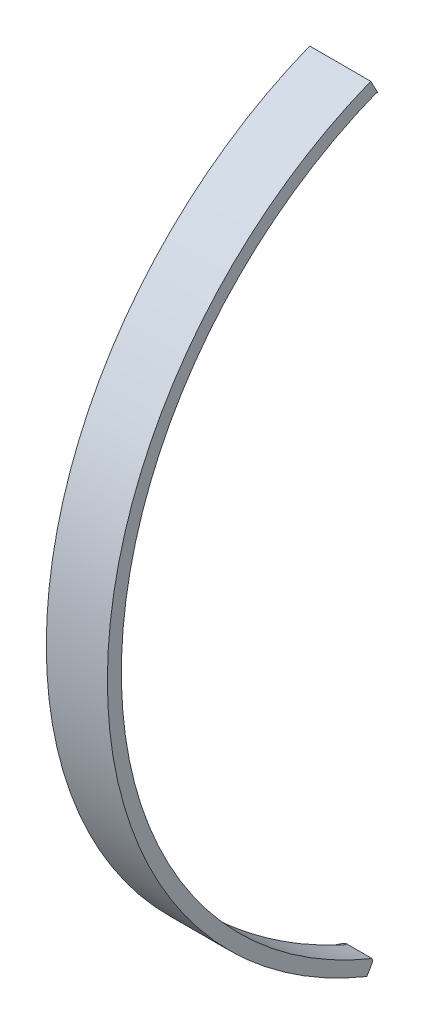
ISO-10303-21;
HEADER;
FILE_DESCRIPTION(('STEP AP214'),'2;1');
FILE_NAME('part.step','',(''),(''),'','','');
FILE_SCHEMA(('AUTOMOTIVE_DESIGN { 1 0 10303 214 1 1 1 1 }'));
ENDSEC;
DATA;
#1=APPLICATION_CONTEXT('core data for automotive mechanical design processes');
#2=APPLICATION_PROTOCOL_DEFINITION('international standard','automotive_design',2000,#1);
#3=PRODUCT_CONTEXT('',#1,'mechanical');
#4=PRODUCT('Part','Part','',(#3));
#5=PRODUCT_RELATED_PRODUCT_CATEGORY('part','',(#4));
#6=PRODUCT_DEFINITION_FORMATION('','',#4);
#7=PRODUCT_DEFINITION_CONTEXT('part definition',#1,'design');
#8=PRODUCT_DEFINITION('design','',#6,#7);
#9=PRODUCT_DEFINITION_SHAPE('','',#8);
#10=(LENGTH_UNIT() NAMED_UNIT(*) SI_UNIT(.MILLI.,.METRE.));
#11=(NAMED_UNIT(*) PLANE_ANGLE_UNIT() SI_UNIT($,.RADIAN.));
#12=(NAMED_UNIT(*) SI_UNIT($,.STERADIAN.) SOLID_ANGLE_UNIT());
#13=UNCERTAINTY_MEASURE_WITH_UNIT(LENGTH_MEASURE(1.E-05),#10,'distance_accuracy_value','');
#14=(GEOMETRIC_REPRESENTATION_CONTEXT(3) GLOBAL_UNCERTAINTY_ASSIGNED_CONTEXT((#13)) GLOBAL_UNIT_ASSIGNED_CONTEXT((#10,
#11,#12)) REPRESENTATION_CONTEXT('',''));
#15=CARTESIAN_POINT('',(0.,0.,0.));
#16=DIRECTION('',(0.,0.,1.));
#17=DIRECTION('',(1.,0.,0.));
#18=AXIS2_PLACEMENT_3D('',#15,#16,#17);
#19=CARTESIAN_POINT('',(-33.9,20.25,10.));
#20=DIRECTION('',(1.,0.,0.));
#21=DIRECTION('',(0.,0.,-1.));
#22=AXIS2_PLACEMENT_3D('',#19,#20,#21);
#23=CYLINDRICAL_SURFACE('',#22,23.8730192372937);
#24=CARTESIAN_POINT('',(-33.182142185749,-1.85759271429399,19.0097387244631));
#25=CARTESIAN_POINT('',(-33.1225665363095,-1.8340313483401,19.0675506331459));
#26=CARTESIAN_POINT('',(-33.0629498017503,-1.81025964298023,19.1252323032314));
#27=CARTESIAN_POINT('',(-32.9436341623926,-1.7622955534485,19.2403351662078));
#28=CARTESIAN_POINT('',(-32.8839352575941,-1.73810316927665,19.2977563590986));
#29=CARTESIAN_POINT('',(-32.8241952676759,-1.7137004456988,19.3550473133921));
#30=B_SPLINE_CURVE_WITH_KNOTS('',3,(#24,#25,#26,#27,#28,#29),.UNSPECIFIED.,.F.,.F.,(4,2,4),(0.,
0.258877995804225,0.517755991608455),.UNSPECIFIED.);
#31=CARTESIAN_POINT('',(-33.1821421857366,-1.85759271428874,19.0097387244721));
#32=VERTEX_POINT('',#31);
#33=CARTESIAN_POINT('',(-32.8241952676758,-1.71370044569875,19.3550473133921));
#34=VERTEX_POINT('',#33);
#35=EDGE_CURVE('E117',#32,#34,#30,.T.);
#36=ORIENTED_EDGE('',*,*,#35,.F.);
#37=DIRECTION('',(1.,0.,0.));
#38=VECTOR('',#37,1.);
#39=CARTESIAN_POINT('',(-33.9,-1.85759271429399,19.0097387244631));
#40=LINE('',#39,#38);
#41=CARTESIAN_POINT('',(-30.4,-1.85759271429399,19.0097387244631));
#42=VERTEX_POINT('',#41);
#43=EDGE_CURVE('E259',#32,#42,#40,.T.);
#44=ORIENTED_EDGE('',*,*,#43,.T.);
#45=CARTESIAN_POINT('',(-30.4,20.25,10.));
#46=DIRECTION('',(-1.,0.,0.));
#47=DIRECTION('',(0.,0.,1.));
#48=AXIS2_PLACEMENT_3D('',#45,#46,#47);
#49=CIRCLE('',#48,23.8730192372937);
#50=CARTESIAN_POINT('',(-30.4,42.4480016143393,18.7846327091112));
#51=VERTEX_POINT('',#50);
#52=EDGE_CURVE('E132',#42,#51,#49,.T.);
#53=ORIENTED_EDGE('',*,*,#52,.T.);
#54=DIRECTION('',(1.,0.,0.));
#55=VECTOR('',#54,1.);
#56=CARTESIAN_POINT('',(-33.9,42.4480016143393,18.7846327091112));
#57=LINE('',#56,#55);
#58=CARTESIAN_POINT('',(-33.9,42.4480016143393,18.7846327091112));
#59=VERTEX_POINT('',#58);
#60=EDGE_CURVE('E283',#59,#51,#57,.T.);
#61=ORIENTED_EDGE('',*,*,#60,.F.);
#62=CARTESIAN_POINT('',(-33.9,20.25,10.));
#63=DIRECTION('',(-1.,0.,0.));
#64=DIRECTION('',(0.,0.,1.));
#65=AXIS2_PLACEMENT_3D('',#62,#63,#64);
#66=CIRCLE('',#65,23.8730192372937);
#67=CARTESIAN_POINT('',(-33.9,2.27686480478922,25.7126528237236));
#68=VERTEX_POINT('',#67);
#69=EDGE_CURVE('E329',#68,#59,#66,.T.);
#70=ORIENTED_EDGE('',*,*,#69,.F.);
#71=CARTESIAN_POINT('',(-32.8241952676759,-1.7137004456988,19.3550473133921));
#72=CARTESIAN_POINT('',(-32.8482325235076,-1.63080687142153,19.5496663536201));
#73=CARTESIAN_POINT('',(-32.8726932525862,-1.54534385320424,19.7431386325032));
#74=CARTESIAN_POINT('',(-32.922412498383,-1.36966227853327,20.1269754393112));
#75=CARTESIAN_POINT('',(-32.9476679124561,-1.27946147274184,20.317348493742));
#76=CARTESIAN_POINT('',(-32.9990235283126,-1.09436437405675,20.6950109075044));
#77=CARTESIAN_POINT('',(-33.0251211624427,-0.999481958086965,20.882307417338));
#78=CARTESIAN_POINT('',(-33.0781980856319,-0.805072025152287,21.2538372897638));
#79=CARTESIAN_POINT('',(-33.1051754037122,-0.705554703783859,21.4380762691174));
#80=CARTESIAN_POINT('',(-33.1600294373046,-0.501913722063597,21.8035086082159));
#81=CARTESIAN_POINT('',(-33.1879048313361,-0.397796752980579,21.9847058952136));
#82=CARTESIAN_POINT('',(-33.244594023606,-0.184986562709229,22.3440652425988));
#83=CARTESIAN_POINT('',(-33.2734071350169,-0.0762966745829273,22.5222293851314));
#84=CARTESIAN_POINT('',(-33.332077245522,0.145638895481034,22.8755284208833));
#85=CARTESIAN_POINT('',(-33.3619342689464,0.258884683611083,23.0506632433567));
#86=CARTESIAN_POINT('',(-33.4227960899939,0.489913533511403,23.3978933685883));
#87=CARTESIAN_POINT('',(-33.4538016825473,0.607699740105736,23.5699864396878));
#88=CARTESIAN_POINT('',(-33.5170792381005,0.847798652330997,23.9111176923892));
#89=CARTESIAN_POINT('',(-33.549352916376,0.9701174753288,24.0801512504623));
#90=CARTESIAN_POINT('',(-33.6152983786745,1.21927694429589,24.4151411726627));
#91=CARTESIAN_POINT('',(-33.6489729646166,1.34612657277389,24.5810903045652));
#92=CARTESIAN_POINT('',(-33.7178669542654,1.60434939344927,24.9098817915395));
#93=CARTESIAN_POINT('',(-33.7530904484956,1.73573433876496,25.0727140600441));
#94=CARTESIAN_POINT('',(-33.825250903236,2.00303264140061,25.3952352892476));
#95=CARTESIAN_POINT('',(-33.8621935058577,2.13896042669196,25.554911029677));
#96=CARTESIAN_POINT('',(-33.9,2.2768648047892,25.7126528237236));
#97=B_SPLINE_CURVE_WITH_KNOTS('',3,(#71,#72,#73,#74,#75,#76,#77,#78,#79,#80,#81,#82,#83,#84,#85,
#86,#87,#88,#89,#90,#91,#92,#93,#94,#95,#96),.UNSPECIFIED.,.F.,.F.,(4,2,2,2,2,2,2,2,2,2,2,2,4),
(0.,0.638675930938489,1.2751094164787,1.90975814897991,2.54307129407708,3.17549166456088,
3.80745880860199,4.4394406915592,5.07186845843258,5.70518330143461,6.33983223149834,
6.97627177613453,7.61497207741191),.UNSPECIFIED.);
#98=EDGE_CURVE('E46',#34,#68,#97,.T.);
#99=ORIENTED_EDGE('',*,*,#98,.F.);
#100=EDGE_LOOP('',(#36,#44,#53,#61,#70,#99));
#101=FACE_BOUND('',#100,.T.);
#102=ADVANCED_FACE('F17',(#101),#23,.T.);
#103=CARTESIAN_POINT('',(-33.9,42.4480016143387,18.7846327091127));
#104=DIRECTION('',(0.,-0.464199920782459,0.885730451969198));
#105=DIRECTION('',(0.,-0.885730451969198,-0.464199920782459));
#106=AXIS2_PLACEMENT_3D('',#103,#104,#105);
#107=PLANE('',#106);
#108=CARTESIAN_POINT('',(-33.9,41.9383395792734,18.517525401492));
#109=CARTESIAN_POINT('',(-33.774944800215,41.8972438244927,18.4959876457659));
#110=CARTESIAN_POINT('',(-33.6500793311939,41.8557060092155,18.4742182118278));
#111=CARTESIAN_POINT('',(-33.4007278546792,41.7717462576684,18.4302159875276));
#112=CARTESIAN_POINT('',(-33.2762418471857,41.7293243213984,18.4079831971655));
#113=CARTESIAN_POINT('',(-33.151945570456,41.686460324632,18.3855187285914));
#114=B_SPLINE_CURVE_WITH_KNOTS('',3,(#108,#109,#110,#111,#112,#113),.UNSPECIFIED.,.F.,.F.,(4,2,
4),(0.,0.400145165349681,0.800290330699361),.UNSPECIFIED.);
#115=CARTESIAN_POINT('',(-33.9,41.9383395792748,18.5175254015118));
#116=VERTEX_POINT('',#115);
#117=CARTESIAN_POINT('',(-33.151945570456,41.6864603246321,18.3855187285914));
#118=VERTEX_POINT('',#117);
#119=EDGE_CURVE('E223',#116,#118,#114,.T.);
#120=ORIENTED_EDGE('',*,*,#119,.F.);
#121=DIRECTION('',(0.,-0.885730451969198,-0.464199920782459));
#122=VECTOR('',#121,1.);
#123=CARTESIAN_POINT('',(-33.9,42.4480016143387,18.7846327091127));
#124=LINE('',#123,#122);
#125=EDGE_CURVE('E279',#59,#116,#124,.T.);
#126=ORIENTED_EDGE('',*,*,#125,.F.);
#127=ORIENTED_EDGE('',*,*,#60,.T.);
#128=DIRECTION('',(0.,-0.885730451969198,-0.464199920782459));
#129=VECTOR('',#128,1.);
#130=CARTESIAN_POINT('',(-30.4,42.4480016143387,18.7846327091127));
#131=LINE('',#130,#129);
#132=CARTESIAN_POINT('',(-30.4,41.6864603246321,18.3855187285914));
#133=VERTEX_POINT('',#132);
#134=EDGE_CURVE('E338',#51,#133,#131,.T.);
#135=ORIENTED_EDGE('',*,*,#134,.T.);
#136=DIRECTION('',(1.,0.,0.));
#137=VECTOR('',#136,1.);
#138=CARTESIAN_POINT('',(-33.9,41.6864603246321,18.3855187285914));
#139=LINE('',#138,#137);
#140=EDGE_CURVE('E321',#118,#133,#139,.T.);
#141=ORIENTED_EDGE('',*,*,#140,.F.);
#142=EDGE_LOOP('',(#120,#126,#127,#135,#141));
#143=FACE_BOUND('',#142,.T.);
#144=ADVANCED_FACE('F239',(#143),#107,.F.);
#145=CARTESIAN_POINT('',(-33.9,41.6864603246321,18.3855187285914));
#146=DIRECTION('',(0.,0.986061709742894,-0.166380000537688));
#147=DIRECTION('',(0.,0.166380000537688,0.986061709742894));
#148=AXIS2_PLACEMENT_3D('',#145,#146,#147);
#149=PLANE('',#148);
#150=CARTESIAN_POINT('',(-33.151945570456,41.6864603246321,18.3855187285914));
#151=CARTESIAN_POINT('',(-33.162021348843,41.6923510551329,18.4204305194947));
#152=CARTESIAN_POINT('',(-33.1720971272299,41.6982417856337,18.4553423103981));
#153=CARTESIAN_POINT('',(-33.1821729056168,41.7041325161345,18.4902541013014));
#154=B_SPLINE_CURVE_WITH_KNOTS('',3,(#150,#151,#152,#153),.UNSPECIFIED.,.F.,.F.,(4,4),(0.,
0.110433221632523),.UNSPECIFIED.);
#155=CARTESIAN_POINT('',(-33.1821729056168,41.7041325161345,18.4902541013014));
#156=VERTEX_POINT('',#155);
#157=EDGE_CURVE('E234',#118,#156,#154,.T.);
#158=ORIENTED_EDGE('',*,*,#157,.F.);
#159=ORIENTED_EDGE('',*,*,#140,.T.);
#160=DIRECTION('',(0.,0.166380000537688,0.986061709742894));
#161=VECTOR('',#160,1.);
#162=CARTESIAN_POINT('',(-30.4,41.6864603246321,18.3855187285914));
#163=LINE('',#162,#161);
#164=CARTESIAN_POINT('',(-30.4,41.7041325161345,18.4902541013014));
#165=VERTEX_POINT('',#164);
#166=EDGE_CURVE('E318',#133,#165,#163,.T.);
#167=ORIENTED_EDGE('',*,*,#166,.T.);
#168=DIRECTION('',(1.,0.,0.));
#169=VECTOR('',#168,1.);
#170=CARTESIAN_POINT('',(-33.9,41.7041325161345,18.4902541013014));
#171=LINE('',#170,#169);
#172=EDGE_CURVE('E313',#156,#165,#171,.T.);
#173=ORIENTED_EDGE('',*,*,#172,.F.);
#174=EDGE_LOOP('',(#158,#159,#167,#173));
#175=FACE_BOUND('',#174,.T.);
#176=ADVANCED_FACE('F242',(#175),#149,.F.);
#177=CARTESIAN_POINT('',(-33.9,20.25,10.));
#178=DIRECTION('',(1.,0.,0.));
#179=DIRECTION('',(0.,0.,-1.));
#180=AXIS2_PLACEMENT_3D('',#177,#178,#179);
#181=CYLINDRICAL_SURFACE('',#180,23.0730192372937);
#182=CARTESIAN_POINT('',(-31.7922370176084,-1.07793633890972,18.8024626240581));
#183=CARTESIAN_POINT('',(-31.8070935159219,-1.08443498978618,18.7867167996909));
#184=CARTESIAN_POINT('',(-31.8219412222999,-1.09091905994948,18.7709567247907));
#185=CARTESIAN_POINT('',(-31.851619051185,-1.10385803884976,18.7394080739237));
#186=CARTESIAN_POINT('',(-31.8664491736921,-1.11031294758674,18.7236194979571));
#187=CARTESIAN_POINT('',(-31.8812705042638,-1.11675327561056,18.7078166714573));
#188=B_SPLINE_CURVE_WITH_KNOTS('',3,(#182,#183,#184,#185,#186,#187),.UNSPECIFIED.,.F.,.F.,(4,2,
4),(0.,0.067807798982838,0.135615597965672),.UNSPECIFIED.);
#189=CARTESIAN_POINT('',(-31.7922370175579,-1.077936338877,18.8024626240297));
#190=VERTEX_POINT('',#189);
#191=CARTESIAN_POINT('',(-31.8812705042638,-1.11675327561056,18.7078166714573));
#192=VERTEX_POINT('',#191);
#193=EDGE_CURVE('E114',#190,#192,#188,.T.);
#194=ORIENTED_EDGE('',*,*,#193,.F.);
#195=CARTESIAN_POINT('',(-33.9,12.8363926180405,31.8495455859082));
#196=CARTESIAN_POINT('',(-33.864928216694,12.5284323234193,31.7450592677378));
#197=CARTESIAN_POINT('',(-33.8287411920487,12.222783634175,31.6340863641721));
#198=CARTESIAN_POINT('',(-33.7543675851645,11.6167207491469,31.3994441990567));
#199=CARTESIAN_POINT('',(-33.716181423948,11.3163054688165,31.2757776055964));
#200=CARTESIAN_POINT('',(-33.6575656898599,10.869978453453,31.0809338696909));
#201=CARTESIAN_POINT('',(-33.6378049683533,10.7219230885651,31.0144307587432));
#202=CARTESIAN_POINT('',(-33.5978477316943,10.4272968766735,30.8783392492714));
#203=CARTESIAN_POINT('',(-33.5776512167745,10.2807260288771,30.808750852395));
#204=CARTESIAN_POINT('',(-33.5163097779612,9.84336122489024,30.5954197312984));
#205=CARTESIAN_POINT('',(-33.474409560197,9.55488897001684,30.4470997077477));
#206=CARTESIAN_POINT('',(-33.3886824714112,8.98448260247668,30.1384601138862));
#207=CARTESIAN_POINT('',(-33.344854297136,8.70255311550599,29.9781323735594));
#208=CARTESIAN_POINT('',(-33.255914824139,8.14584124511983,29.6458302952307));
#209=CARTESIAN_POINT('',(-33.2108034968033,7.87105902134851,29.4738556973884));
#210=CARTESIAN_POINT('',(-33.1202292859298,7.32901773628106,29.1185107865197));
#211=CARTESIAN_POINT('',(-33.0747663977575,7.06175877437741,28.9351403230411));
#212=CARTESIAN_POINT('',(-32.9846203071851,6.53512110272461,28.5572454979617));
#213=CARTESIAN_POINT('',(-32.9399371008171,6.2757423528681,28.3627211931444));
#214=CARTESIAN_POINT('',(-32.8376471667455,5.67866211819569,27.8949388005632));
#215=CARTESIAN_POINT('',(-32.780793813853,5.34421397769663,27.6173430821481));
#216=CARTESIAN_POINT('',(-32.6718480989232,4.69110606187275,27.0432994653673));
#217=CARTESIAN_POINT('',(-32.6197557345576,4.37244627882651,26.7468515762215));
#218=CARTESIAN_POINT('',(-32.5205763787576,3.75198998803313,26.1359667315062));
#219=CARTESIAN_POINT('',(-32.4734897341661,3.45019464949761,25.8215285317199));
#220=CARTESIAN_POINT('',(-32.3839659663844,2.86505056663772,25.1762037681624));
#221=CARTESIAN_POINT('',(-32.3415217483317,2.58167395037315,24.8453434595516));
#222=CARTESIAN_POINT('',(-32.2603982110107,2.03391539519608,24.1678593777943));
#223=CARTESIAN_POINT('',(-32.2217186637,1.7695323060179,23.8212365613196));
#224=CARTESIAN_POINT('',(-32.1474639750808,1.26075786263175,23.1134569045218));
#225=CARTESIAN_POINT('',(-32.1118877261564,1.01635937756989,22.7523053175498));
#226=CARTESIAN_POINT('',(-32.0599404907262,0.661830606769009,22.1950106961693));
#227=CARTESIAN_POINT('',(-32.0426219772408,0.544059488319621,22.0037734689145));
#228=CARTESIAN_POINT('',(-32.0086073447502,0.314150316916037,21.6179397851926));
#229=CARTESIAN_POINT('',(-31.9919110836602,0.202010975947019,21.4233441106243));
#230=CARTESIAN_POINT('',(-31.9590972299086,-0.0165445064632739,21.0309484214267));
#231=CARTESIAN_POINT('',(-31.9429795711788,-0.122961302035939,20.8331487764138));
#232=CARTESIAN_POINT('',(-31.9113344148302,-0.329889801814305,20.4346873479759));
#233=CARTESIAN_POINT('',(-31.8958063485031,-0.430407250269796,20.2340285933646));
#234=CARTESIAN_POINT('',(-31.865302064466,-0.625571558994802,19.8298068351366));
#235=CARTESIAN_POINT('',(-31.8503259094077,-0.720217753601832,19.6262435054156));
#236=CARTESIAN_POINT('',(-31.820895818405,-0.90356447215441,19.2163634772633));
#237=CARTESIAN_POINT('',(-31.8064420022196,-0.992263636534426,19.0100461620757));
#238=CARTESIAN_POINT('',(-31.7922370176084,-1.07793633890972,18.8024626240581));
#239=B_SPLINE_CURVE_WITH_KNOTS('',3,(#195,#196,#197,#198,#199,#200,#201,#202,#203,#204,#205,
#206,#207,#208,#209,#210,#211,#212,#213,#214,#215,#216,#217,#218,#219,#220,#221,#222,#223,#224,
#225,#226,#227,#228,#229,#230,#231,#232,#233,#234,#235,#236,#237,#238),.UNSPECIFIED.,.F.,.F.,(4,
2,2,2,2,2,2,2,2,2,2,2,2,2,2,2,2,2,2,2,2,4),(0.,0.981223808385092,1.96224179383039,
2.45272172515589,2.9432013945651,3.92407495933614,4.9056220790544,5.88719110421151,
6.8687730911453,7.85035008135187,9.16464831857646,10.4789459130263,11.7933345149409,
13.1056854555461,14.4179568518409,15.7297579448956,16.4054553548837,17.0809975192037,
17.7564622989424,18.4312580709972,19.1061302097637,19.7811561103552),.UNSPECIFIED.);
#240=CARTESIAN_POINT('',(-33.9,12.8363926180095,31.8495455858988));
#241=VERTEX_POINT('',#240);
#242=EDGE_CURVE('E99',#241,#190,#239,.T.);
#243=ORIENTED_EDGE('',*,*,#242,.F.);
#244=CARTESIAN_POINT('',(-33.9,20.25,10.));
#245=DIRECTION('',(1.,0.,0.));
#246=DIRECTION('',(0.,0.,1.));
#247=AXIS2_PLACEMENT_3D('',#244,#245,#246);
#248=CIRCLE('',#247,23.0730192372937);
#249=CARTESIAN_POINT('',(-33.9,30.8113071885345,30.5139710244978));
#250=VERTEX_POINT('',#249);
#251=EDGE_CURVE('E271',#250,#241,#248,.T.);
#252=ORIENTED_EDGE('',*,*,#251,.F.);
#253=CARTESIAN_POINT('',(-32.6308216737922,41.548176793347,18.8742257129205));
#254=CARTESIAN_POINT('',(-32.6433927442418,41.3808301908767,19.2759009727296));
#255=CARTESIAN_POINT('',(-32.6570202577415,41.2021011519144,19.6728050345782));
#256=CARTESIAN_POINT('',(-32.687295904126,40.822572831126,20.4557398097733));
#257=CARTESIAN_POINT('',(-32.7039436799637,40.6217761591787,20.8417718021605));
#258=CARTESIAN_POINT('',(-32.7411688869953,40.1987814101402,21.6017017300487));
#259=CARTESIAN_POINT('',(-32.7617460567703,39.9765847572564,21.9756004708285));
#260=CARTESIAN_POINT('',(-32.8062070388864,39.5182193494979,22.6995342937859));
#261=CARTESIAN_POINT('',(-32.8299789964265,39.2826346445929,23.0499462889606));
#262=CARTESIAN_POINT('',(-32.8812125379729,38.7927375154648,23.7371452652056));
#263=CARTESIAN_POINT('',(-32.9086741073967,38.5384251652605,24.0739323001187));
#264=CARTESIAN_POINT('',(-32.967270340274,38.0118867535585,24.7328703245115));
#265=CARTESIAN_POINT('',(-32.9984050866922,37.7396602875027,25.0550209831771));
#266=CARTESIAN_POINT('',(-33.0675668851951,37.1504438901436,25.7147584930318));
#267=CARTESIAN_POINT('',(-33.1059709002589,36.8316877200982,26.0507307686006));
#268=CARTESIAN_POINT('',(-33.1871188238533,36.1747892012193,26.7026785969265));
#269=CARTESIAN_POINT('',(-33.2298632740739,35.8366444349708,27.0186516457556));
#270=CARTESIAN_POINT('',(-33.3195369441355,35.1422591043525,27.6294840320543));
#271=CARTESIAN_POINT('',(-33.366466691519,34.7860162612241,27.9243406994067));
#272=CARTESIAN_POINT('',(-33.4654522931773,34.0448894720928,28.5011568280406));
#273=CARTESIAN_POINT('',(-33.5176251727015,33.6594509814723,28.7823857445943));
#274=CARTESIAN_POINT('',(-33.5978128230588,33.069035770376,29.1857599718008));
#275=CARTESIAN_POINT('',(-33.6248647355813,32.8701782228701,29.3171455556914));
#276=CARTESIAN_POINT('',(-33.6794046445558,32.4685237590447,29.5736727791256));
#277=CARTESIAN_POINT('',(-33.7068926410631,32.2657268422263,29.6988144178785));
#278=CARTESIAN_POINT('',(-33.7620625394061,31.8564047268479,29.9427265086761));
#279=CARTESIAN_POINT('',(-33.7897444135396,31.6498800545335,30.0614978507552));
#280=CARTESIAN_POINT('',(-33.8450148880289,31.2332427517723,30.2925933958093));
#281=CARTESIAN_POINT('',(-33.8726034885237,31.0231301266684,30.4049176083836));
#282=CARTESIAN_POINT('',(-33.9,30.8113071885342,30.5139710244979));
#283=B_SPLINE_CURVE_WITH_KNOTS('',3,(#253,#254,#255,#256,#257,#258,#259,#260,#261,#262,#263,
#264,#265,#266,#267,#268,#269,#270,#271,#272,#273,#274,#275,#276,#277,#278,#279,#280,#281,#282),
.UNSPECIFIED.,.F.,.F.,(4,2,2,2,2,2,2,2,2,2,2,2,2,2,4),(0.,1.30579910046365,2.61144393347208,
3.91700193342772,5.18508897864352,6.4531710121632,7.72128169287522,9.11455057830523,
10.5079935590788,11.9016124275075,13.3405214392381,14.0600430932918,14.7795648384774,
15.4989857914485,16.2184056732078),.UNSPECIFIED.);
#284=CARTESIAN_POINT('',(-32.6308216737891,41.5481767933459,18.8742257129192));
#285=VERTEX_POINT('',#284);
#286=EDGE_CURVE('E38',#285,#250,#283,.T.);
#287=ORIENTED_EDGE('',*,*,#286,.F.);
#288=CARTESIAN_POINT('',(-33.1821729056168,41.7041325161345,18.4902541013014));
#289=CARTESIAN_POINT('',(-33.0905537361533,41.6785781182408,18.5548189385224));
#290=CARTESIAN_POINT('',(-32.9987982154367,41.6528046090618,18.6190989914341));
#291=CARTESIAN_POINT('',(-32.8150144714974,41.6008193681333,18.7470895286389));
#292=CARTESIAN_POINT('',(-32.7229862482747,41.5746076363837,18.8108000129321));
#293=CARTESIAN_POINT('',(-32.6308216737989,41.548176793349,18.8742257129159));
#294=B_SPLINE_CURVE_WITH_KNOTS('',3,(#288,#289,#290,#291,#292,#293),.UNSPECIFIED.,.F.,.F.,(4,2,
4),(0.,0.344873123100845,0.689746246201693),.UNSPECIFIED.);
#295=EDGE_CURVE('E135',#156,#285,#294,.T.);
#296=ORIENTED_EDGE('',*,*,#295,.F.);
#297=ORIENTED_EDGE('',*,*,#172,.T.);
#298=CARTESIAN_POINT('',(-30.4,20.25,10.));
#299=DIRECTION('',(1.,0.,0.));
#300=DIRECTION('',(0.,0.,1.));
#301=AXIS2_PLACEMENT_3D('',#298,#299,#300);
#302=CIRCLE('',#301,23.0730192372937);
#303=CARTESIAN_POINT('',(-30.4,-1.11675327561056,18.7078166714573));
#304=VERTEX_POINT('',#303);
#305=EDGE_CURVE('E334',#165,#304,#302,.T.);
#306=ORIENTED_EDGE('',*,*,#305,.T.);
#307=DIRECTION('',(1.,0.,0.));
#308=VECTOR('',#307,1.);
#309=CARTESIAN_POINT('',(-33.9,-1.11675327561056,18.7078166714573));
#310=LINE('',#309,#308);
#311=EDGE_CURVE('E125',#192,#304,#310,.T.);
#312=ORIENTED_EDGE('',*,*,#311,.F.);
#313=EDGE_LOOP('',(#194,#243,#252,#287,#296,#297,#306,#312));
#314=FACE_BOUND('',#313,.T.);
#315=ADVANCED_FACE('F123',(#314),#181,.F.);
#316=CARTESIAN_POINT('',(-33.9,-1.11675327561056,18.7078166714573));
#317=DIRECTION('',(0.,-0.226898717124298,0.973918360114105));
#318=DIRECTION('',(0.,-0.973918360114105,-0.226898717124298));
#319=AXIS2_PLACEMENT_3D('',#316,#317,#318);
#320=PLANE('',#319);
#321=CARTESIAN_POINT('',(-31.8812705042638,-1.11675327561056,18.7078166714573));
#322=CARTESIAN_POINT('',(-31.9301806101318,-1.14393731473797,18.7014834675083));
#323=CARTESIAN_POINT('',(-31.9791522566391,-1.17101523630979,18.6951749863063));
#324=CARTESIAN_POINT('',(-32.0772186309322,-1.22495884434227,18.6826074693964));
#325=CARTESIAN_POINT('',(-32.126313358718,-1.25182453080292,18.6763484336884));
#326=CARTESIAN_POINT('',(-32.1754696271431,-1.27858409970799,18.6701141207275));
#327=B_SPLINE_CURVE_WITH_KNOTS('',3,(#321,#322,#323,#324,#325,#326),.UNSPECIFIED.,.F.,.F.,(4,2,
4),(0.,0.16894110334737,0.337882206694745),.UNSPECIFIED.);
#328=CARTESIAN_POINT('',(-32.1754696271431,-1.27858409970799,18.6701141207275));
#329=VERTEX_POINT('',#328);
#330=EDGE_CURVE('E127',#192,#329,#327,.T.);
#331=ORIENTED_EDGE('',*,*,#330,.F.);
#332=ORIENTED_EDGE('',*,*,#311,.T.);
#333=DIRECTION('',(0.,-0.973918360114105,-0.226898717124298));
#334=VECTOR('',#333,1.);
#335=CARTESIAN_POINT('',(-30.4,-1.11675327561056,18.7078166714573));
#336=LINE('',#335,#334);
#337=CARTESIAN_POINT('',(-30.4,-1.27858409970799,18.6701141207275));
#338=VERTEX_POINT('',#337);
#339=EDGE_CURVE('E330',#304,#338,#336,.T.);
#340=ORIENTED_EDGE('',*,*,#339,.T.);
#341=DIRECTION('',(1.,0.,0.));
#342=VECTOR('',#341,1.);
#343=CARTESIAN_POINT('',(-33.9,-1.27858409970799,18.6701141207275));
#344=LINE('',#343,#342);
#345=EDGE_CURVE('E270',#329,#338,#344,.T.);
#346=ORIENTED_EDGE('',*,*,#345,.F.);
#347=EDGE_LOOP('',(#331,#332,#340,#346));
#348=FACE_BOUND('',#347,.T.);
#349=ADVANCED_FACE('F251',(#348),#320,.F.);
#350=CARTESIAN_POINT('',(-33.9,-1.27858409970799,18.6701141207275));
#351=DIRECTION('',(0.,0.505947614141217,0.862564207317235));
#352=DIRECTION('',(0.,-0.862564207317235,0.505947614141217));
#353=AXIS2_PLACEMENT_3D('',#350,#351,#352);
#354=PLANE('',#353);
#355=CARTESIAN_POINT('',(-32.1754696271431,-1.27858409970799,18.6701141207275));
#356=CARTESIAN_POINT('',(-32.230504423245,-1.31189695402527,18.6896541839704));
#357=CARTESIAN_POINT('',(-32.2856770672764,-1.34504070969902,18.7090950603302));
#358=CARTESIAN_POINT('',(-32.3963029990754,-1.41096416401955,18.7477632709358));
#359=CARTESIAN_POINT('',(-32.45175624842,-1.44374391064569,18.7669906333246));
#360=CARTESIAN_POINT('',(-32.5629589276403,-1.50891999060721,18.8052204623342));
#361=CARTESIAN_POINT('',(-32.6187083354352,-1.54131635196116,18.8242229453898));
#362=CARTESIAN_POINT('',(-32.730518893357,-1.60570730809408,18.8619922503892));
#363=CARTESIAN_POINT('',(-32.7865800461528,-1.63770189942572,18.880759070311));
#364=CARTESIAN_POINT('',(-32.8990273705287,-1.70127035813229,18.9180459293579));
#365=CARTESIAN_POINT('',(-32.9554135629879,-1.73284419803865,18.9365659523712));
#366=CARTESIAN_POINT('',(-33.0685240886729,-1.79555349020741,18.9733488567488));
#367=CARTESIAN_POINT('',(-33.1252484694636,-1.82668887862897,18.9916117006665));
#368=CARTESIAN_POINT('',(-33.1821421857366,-1.85759271428874,19.0097387244721));
#369=B_SPLINE_CURVE_WITH_KNOTS('',3,(#355,#356,#357,#358,#359,#360,#361,#362,#363,#364,#365,
#366,#367,#368),.UNSPECIFIED.,.F.,.F.,(4,2,2,2,2,2,4),(0.,0.201701423443757,0.403375937670601,
0.605035620948136,0.80669703334791,1.0083715472509,1.210075128559),.UNSPECIFIED.);
#370=EDGE_CURVE('E11',#329,#32,#369,.T.);
#371=ORIENTED_EDGE('',*,*,#370,.F.);
#372=ORIENTED_EDGE('',*,*,#345,.T.);
#373=DIRECTION('',(0.,-0.862564207317235,0.505947614141217));
#374=VECTOR('',#373,1.);
#375=CARTESIAN_POINT('',(-30.4,-1.27858409970799,18.6701141207275));
#376=LINE('',#375,#374);
#377=EDGE_CURVE('E267',#338,#42,#376,.T.);
#378=ORIENTED_EDGE('',*,*,#377,.T.);
#379=ORIENTED_EDGE('',*,*,#43,.F.);
#380=EDGE_LOOP('',(#371,#372,#378,#379));
#381=FACE_BOUND('',#380,.T.);
#382=ADVANCED_FACE('F264',(#381),#354,.F.);
#383=CARTESIAN_POINT('',(-33.9,20.25,10.));
#384=DIRECTION('',(-1.,0.,0.));
#385=DIRECTION('',(0.,0.,1.));
#386=AXIS2_PLACEMENT_3D('',#383,#384,#385);
#387=PLANE('',#386);
#388=ORIENTED_EDGE('',*,*,#125,.T.);
#389=CARTESIAN_POINT('',(-33.9,41.9225736648829,18.2925937255391));
#390=CARTESIAN_POINT('',(-33.9,41.9358131259489,18.481151856025));
#391=CARTESIAN_POINT('',(-33.9,41.9489959913007,18.6697139261954));
#392=CARTESIAN_POINT('',(-33.9,41.9752485305757,19.0468459459055));
#393=CARTESIAN_POINT('',(-33.9,41.988318204499,19.2354158954451));
#394=CARTESIAN_POINT('',(-33.9,42.0013312827079,19.4239897846694));
#395=B_SPLINE_CURVE_WITH_KNOTS('',3,(#389,#390,#391,#392,#393,#394),.UNSPECIFIED.,.F.,.F.,(4,2,
4),(0.,0.567066997992803,1.13413399598561),.UNSPECIFIED.);
#396=CARTESIAN_POINT('',(-33.9,42.0013312827079,19.4239897846693));
#397=VERTEX_POINT('',#396);
#398=EDGE_CURVE('E31',#116,#397,#395,.T.);
#399=ORIENTED_EDGE('',*,*,#398,.T.);
#400=CARTESIAN_POINT('',(-33.9,42.001331282708,19.4239897846694));
#401=CARTESIAN_POINT('',(-33.9,41.8923177037711,19.6602756635951));
#402=CARTESIAN_POINT('',(-33.9,41.7791901941302,19.8946665233124));
#403=CARTESIAN_POINT('',(-33.9,41.5447523879879,20.3593250842505));
#404=CARTESIAN_POINT('',(-33.9,41.4234419206158,20.5895926992455));
#405=CARTESIAN_POINT('',(-33.9,41.1727273845266,21.0455898130262));
#406=CARTESIAN_POINT('',(-33.9,41.0433258811844,21.2713207205422));
#407=CARTESIAN_POINT('',(-33.9,40.776511115253,21.7179792383202));
#408=CARTESIAN_POINT('',(-33.9,40.6390979325217,21.9389068964294));
#409=CARTESIAN_POINT('',(-33.9,40.2155209338818,22.593447942312));
#410=CARTESIAN_POINT('',(-33.9,39.9176189316718,23.0195481182103));
#411=CARTESIAN_POINT('',(-33.9,39.2926402489776,23.8497820049912));
#412=CARTESIAN_POINT('',(-33.9,38.9655589937764,24.2539122553928));
#413=CARTESIAN_POINT('',(-33.9,38.2189676691797,25.113820314082));
#414=CARTESIAN_POINT('',(-33.9,37.7937536519373,25.5646639803783));
#415=CARTESIAN_POINT('',(-33.9,36.908280040016,26.4305212792182));
#416=CARTESIAN_POINT('',(-33.9,36.4480170624584,26.8455314448902));
#417=CARTESIAN_POINT('',(-33.9,35.4955702257543,27.6378296519407));
#418=CARTESIAN_POINT('',(-33.9,35.0033645996692,28.0150915156172));
#419=CARTESIAN_POINT('',(-33.9,33.99097636112,28.7299381949011));
#420=CARTESIAN_POINT('',(-33.9,33.470793561044,29.0675227443884));
#421=CARTESIAN_POINT('',(-33.9,32.3766790306495,29.7193653600674));
#422=CARTESIAN_POINT('',(-33.9,31.8013655415342,30.0313044801378));
#423=CARTESIAN_POINT('',(-33.9,30.6276489131307,30.6088422181699));
#424=CARTESIAN_POINT('',(-33.9,30.0292353104683,30.8744195281604));
#425=CARTESIAN_POINT('',(-33.9,28.8132434825019,31.3585325961417));
#426=CARTESIAN_POINT('',(-33.9,28.1956533556304,31.5770384443184));
#427=CARTESIAN_POINT('',(-33.9,26.945811889932,31.9659468852829));
#428=CARTESIAN_POINT('',(-33.9,26.313566193147,32.1363676674609));
#429=CARTESIAN_POINT('',(-33.9,24.9865524835765,32.4401202031906));
#430=CARTESIAN_POINT('',(-33.9,24.2908400223934,32.5693759488043));
#431=CARTESIAN_POINT('',(-33.9,23.2412141447884,32.7195225316669));
#432=CARTESIAN_POINT('',(-33.9,22.8902930891248,32.7622840244856));
#433=CARTESIAN_POINT('',(-33.9,22.1869297308586,32.8330490424866));
#434=CARTESIAN_POINT('',(-33.9,21.8344873785816,32.8610520820333));
#435=CARTESIAN_POINT('',(-33.9,21.1290578912616,32.9020553689779));
#436=CARTESIAN_POINT('',(-33.9,20.7760715719125,32.9150695972434));
#437=CARTESIAN_POINT('',(-33.9,20.0698917615376,32.9259149516217));
#438=CARTESIAN_POINT('',(-33.9,19.7166982728888,32.9237462486589));
#439=CARTESIAN_POINT('',(-33.9,18.657760915574,32.8944552297311));
#440=CARTESIAN_POINT('',(-33.9,17.9525059314092,32.8445569938848));
#441=CARTESIAN_POINT('',(-33.9,16.5517009622705,32.684763383966));
#442=CARTESIAN_POINT('',(-33.9,15.8561239954544,32.5751007475724));
#443=CARTESIAN_POINT('',(-33.9,14.4767912817827,32.2973153355487));
#444=CARTESIAN_POINT('',(-33.9,13.7930346806859,32.1291968031398));
#445=CARTESIAN_POINT('',(-33.9,12.441063530932,31.7364769533332));
#446=CARTESIAN_POINT('',(-33.9,11.7728694180063,31.511805490814));
#447=CARTESIAN_POINT('',(-33.9,10.4568533064853,31.0088496893839));
#448=CARTESIAN_POINT('',(-33.9,9.80903501784909,30.7305556520443));
#449=CARTESIAN_POINT('',(-33.9,8.74101237980293,30.2224050017967));
#450=CARTESIAN_POINT('',(-33.9,8.31448756068545,30.0056699723866));
#451=CARTESIAN_POINT('',(-33.9,7.47312530499149,29.5505877956269));
#452=CARTESIAN_POINT('',(-33.9,7.05828719459467,29.312241897651));
#453=CARTESIAN_POINT('',(-33.9,6.24167539296507,28.8141228139317));
#454=CARTESIAN_POINT('',(-33.9,5.83990156865861,28.5543498465411));
#455=CARTESIAN_POINT('',(-33.9,5.05165315655912,28.0133975839734));
#456=CARTESIAN_POINT('',(-33.9,4.66516225852426,27.732242100122));
#457=CARTESIAN_POINT('',(-33.9,3.90873810191652,27.1485185750496));
#458=CARTESIAN_POINT('',(-33.9,3.53880365003018,26.8459520811075));
#459=CARTESIAN_POINT('',(-33.9,2.81697586176196,26.2201548872338));
#460=CARTESIAN_POINT('',(-33.9,2.46507846718366,25.8969288726328));
#461=CARTESIAN_POINT('',(-33.9,1.84895270332693,25.2978342140328));
#462=CARTESIAN_POINT('',(-33.9,1.58129953743866,25.0254741540406));
#463=CARTESIAN_POINT('',(-33.9,1.05840564388682,24.4690913333197));
#464=CARTESIAN_POINT('',(-33.9,0.803164753945699,24.1850687251563));
#465=CARTESIAN_POINT('',(-33.9,0.305355728613627,23.606101672726));
#466=CARTESIAN_POINT('',(-33.9,0.062788463819576,23.3111564805193));
#467=CARTESIAN_POINT('',(-33.9,-0.409763579578695,22.7107800849469));
#468=CARTESIAN_POINT('',(-33.9,-0.639732768252954,22.4053366179325));
#469=CARTESIAN_POINT('',(-33.9,-1.08656233878059,21.7850592234858));
#470=CARTESIAN_POINT('',(-33.9,-1.30342411228109,21.4702262982752));
#471=CARTESIAN_POINT('',(-33.9,-1.72363096906281,20.8318108000734));
#472=CARTESIAN_POINT('',(-33.9,-1.92698037550786,20.5082310726111));
#473=CARTESIAN_POINT('',(-33.9,-2.12342628026579,20.1805123495908));
#474=B_SPLINE_CURVE_WITH_KNOTS('',3,(#400,#401,#402,#403,#404,#405,#406,#407,#408,#409,#410,
#411,#412,#413,#414,#415,#416,#417,#418,#419,#420,#421,#422,#423,#424,#425,#426,#427,#428,#429,
#430,#431,#432,#433,#434,#435,#436,#437,#438,#439,#440,#441,#442,#443,#444,#445,#446,#447,#448,
#449,#450,#451,#452,#453,#454,#455,#456,#457,#458,#459,#460,#461,#462,#463,#464,#465,#466,#467,
#468,#469,#470,#471,#472,#473),.UNSPECIFIED.,.F.,.F.,(4,2,2,2,2,2,2,2,2,2,2,2,2,2,2,2,2,2,2,2,2,
2,2,2,2,2,2,2,2,2,2,2,2,2,2,2,4),(0.,0.78062694317739,1.56127019190227,2.34166716981598,
3.12205637029922,4.68034562516953,6.23887961909644,8.09593759704624,9.95317504348916,
11.8116916485313,13.6702207181323,15.6314230956739,17.5935244857391,19.5568689667944,
21.5194697644845,23.6396330111203,24.6999317314724,25.7602653393975,26.8196091142956,
27.8789409634659,29.9971427376422,32.1071540365481,34.2170122050299,36.3295003322753,
38.4423708932173,39.877102478653,41.3117511717905,42.7463852469213,44.1794444858798,
45.6124002695457,47.0450322213119,48.1902479011457,49.3354486044514,50.4807278725607,
51.6273937963861,52.7739377611805,53.9201131152406),.UNSPECIFIED.);
#475=EDGE_CURVE('E291',#397,#250,#474,.T.);
#476=ORIENTED_EDGE('',*,*,#475,.T.);
#477=ORIENTED_EDGE('',*,*,#251,.T.);
#478=EDGE_CURVE('E104',#241,#68,#474,.T.);
#479=ORIENTED_EDGE('',*,*,#478,.T.);
#480=ORIENTED_EDGE('',*,*,#69,.T.);
#481=EDGE_LOOP('',(#388,#399,#476,#477,#479,#480));
#482=FACE_BOUND('',#481,.T.);
#483=ADVANCED_FACE('F293',(#482),#387,.T.);
#484=CARTESIAN_POINT('',(-30.4,20.25,10.));
#485=DIRECTION('',(-1.,0.,0.));
#486=DIRECTION('',(0.,0.,1.));
#487=AXIS2_PLACEMENT_3D('',#484,#485,#486);
#488=PLANE('',#487);
#489=ORIENTED_EDGE('',*,*,#52,.F.);
#490=ORIENTED_EDGE('',*,*,#377,.F.);
#491=ORIENTED_EDGE('',*,*,#339,.F.);
#492=ORIENTED_EDGE('',*,*,#305,.F.);
#493=ORIENTED_EDGE('',*,*,#166,.F.);
#494=ORIENTED_EDGE('',*,*,#134,.F.);
#495=EDGE_LOOP('',(#489,#490,#491,#492,#493,#494));
#496=FACE_BOUND('',#495,.T.);
#497=ADVANCED_FACE('F297',(#496),#488,.F.);
#498=CARTESIAN_POINT('',(-45.4,-6.55,19.9919967974375));
#499=CARTESIAN_POINT('',(-42.9474711237994,-5.58343134624236,21.5482461984307));
#500=CARTESIAN_POINT('',(-38.8452236748212,-4.36314029614705,21.7948721296961));
#501=CARTESIAN_POINT('',(-35.7488731053253,-3.14452754699726,20.7423511785006));
#502=CARTESIAN_POINT('',(-33.1088606635449,-1.9711535487707,19.5259731395019));
#503=CARTESIAN_POINT('',(-31.7099035523972,-1.05983966410198,18.8230933709355));
#504=CARTESIAN_POINT('',(-30.4,-0.126414364261386,17.9517739034093));
#505=CARTESIAN_POINT('',(-45.4,-6.02624463607328,20.697330815517));
#506=CARTESIAN_POINT('',(-42.9667994064322,-5.10054395620893,22.1829497200703));
#507=CARTESIAN_POINT('',(-38.8905319403896,-3.93184864363026,22.3944735559936));
#508=CARTESIAN_POINT('',(-35.7833728754233,-2.76476067096217,21.3537098914316));
#509=CARTESIAN_POINT('',(-33.1305091924962,-1.64099868697704,20.1560845261821));
#510=CARTESIAN_POINT('',(-31.7217667454429,-0.768216521567986,19.4602583740878));
#511=CARTESIAN_POINT('',(-30.4,0.125742155188987,18.5979247858895));
#512=CARTESIAN_POINT('',(-45.4,-5.48904416774667,21.3834181928792));
#513=CARTESIAN_POINT('',(-42.9856321010996,-4.6016058499407,22.801750090254));
#514=CARTESIAN_POINT('',(-38.9352845068495,-3.48121669503081,22.9811475073487));
#515=CARTESIAN_POINT('',(-35.8177845985196,-2.36236844322723,21.9542816125705));
#516=CARTESIAN_POINT('',(-33.1523142950818,-1.28505536949167,20.7780609418986));
#517=CARTESIAN_POINT('',(-31.7337701429312,-0.448348263661452,20.0920677260724));
#518=CARTESIAN_POINT('',(-30.4000000000001,0.408660056182357,19.2422123040708));
#519=CARTESIAN_POINT('',(-45.4,-4.16371581618031,22.9913749251739));
#520=CARTESIAN_POINT('',(-43.0298188410961,-3.36184329103559,24.254529733483));
#521=CARTESIAN_POINT('',(-39.0416846211502,-2.34948078297595,24.3623201533818));
#522=CARTESIAN_POINT('',(-35.9003496034471,-1.33851060591491,23.3724176126435));
#523=CARTESIAN_POINT('',(-33.2050994223679,-0.365070832471882,22.2520860114712));
#524=CARTESIAN_POINT('',(-31.7629298502163,0.390961926502743,21.5945636495552));
#525=CARTESIAN_POINT('',(-30.4,1.16533847955615,20.7807845702262));
#526=CARTESIAN_POINT('',(-45.4,-2.76131992456492,24.5010519228363));
#527=CARTESIAN_POINT('',(-43.071351427931,-2.02943255328612,25.6222262914085));
#528=CARTESIAN_POINT('',(-39.1448658001608,-1.10542616605421,25.668544026831));
#529=CARTESIAN_POINT('',(-35.9820473094071,-0.182690591014238,24.7198467773121));
#530=CARTESIAN_POINT('',(-33.258324706574,0.705790127193555,23.6607293980583));
#531=CARTESIAN_POINT('',(-31.7925010508129,1.39583849681799,23.038384522388));
#532=CARTESIAN_POINT('',(-30.4,2.10262966634823,22.269133837899));
#533=CARTESIAN_POINT('',(-45.4,-0.777796385175953,26.475833152822));
#534=CARTESIAN_POINT('',(-43.1256980519241,-0.129273125541658,27.4139420809604));
#535=CARTESIAN_POINT('',(-39.2827517845494,0.689486232497745,27.384148545125));
#536=CARTESIAN_POINT('',(-36.0926009909592,1.50711952784313,26.4940187757912));
#537=CARTESIAN_POINT('',(-33.3311558959604,2.29439969456314,25.5213853279005));
#538=CARTESIAN_POINT('',(-31.833076477034,2.90584953725667,24.9513180719158));
#539=CARTESIAN_POINT('',(-30.4,3.53213512600625,24.2482150455257));
#540=CARTESIAN_POINT('',(-45.4,1.35459155894493,28.1988663152518));
#541=CARTESIAN_POINT('',(-43.1730816781758,1.94473968464109,28.9815449393591));
#542=CARTESIAN_POINT('',(-39.4102273736662,2.68980054899995,28.8930796181833));
#543=CARTESIAN_POINT('',(-36.197983987918,3.43383671073772,28.0616614578378));
#544=CARTESIAN_POINT('',(-33.4023395475795,4.15025190167588,27.1755092148687));
#545=CARTESIAN_POINT('',(-31.8728839366739,4.70666367765516,26.6620866092474));
#546=CARTESIAN_POINT('',(-30.4,5.27657579861512,26.0305975775542));
#547=CARTESIAN_POINT('',(-45.4,3.67940475056658,29.8337278564909));
#548=CARTESIAN_POINT('',(-43.2177955026143,4.21071355145228,30.464851839182));
#549=CARTESIAN_POINT('',(-39.5349760403241,4.88148988199945,30.3167435297707));
#550=CARTESIAN_POINT('',(-36.3024310418001,5.55134367597429,29.5340806388986));
#551=CARTESIAN_POINT('',(-33.473414405811,6.19633038273887,28.7223896143757));
#552=CARTESIAN_POINT('',(-31.9124206750363,6.69726643700518,28.2562380266028));
#553=CARTESIAN_POINT('',(-30.4000000000001,7.21035681625132,27.6845068221359));
#554=CARTESIAN_POINT('',(-45.4,6.43408354867222,31.3365216015788));
#555=CARTESIAN_POINT('',(-43.258104879453,6.8768316507175,31.8101823576979));
#556=CARTESIAN_POINT('',(-39.6550172143178,7.43580027066055,31.5859128049158));
#557=CARTESIAN_POINT('',(-36.4040387743127,7.99400012644664,30.8168119580984));
#558=CARTESIAN_POINT('',(-33.5424585973685,8.53147784157549,30.0365788742755));
#559=CARTESIAN_POINT('',(-31.949939230879,8.94891584923825,29.5805686237538));
#560=CARTESIAN_POINT('',(-30.4,9.37648224986276,29.0216259284844));
#561=CARTESIAN_POINT('',(-45.4,10.3645592899923,33.2489674518679));
#562=CARTESIAN_POINT('',(-43.3090240667326,10.6827367589259,33.5153324467972));
#563=CARTESIAN_POINT('',(-39.8127173221624,11.0844351960663,33.1869409947378));
#564=CARTESIAN_POINT('',(-36.5389679667812,11.4855811672483,32.4232726853939));
#565=CARTESIAN_POINT('',(-33.6346234810618,11.8718353336378,31.6697627081853));
#566=CARTESIAN_POINT('',(-31.9997140388901,12.1718239007849,31.215040794118));
#567=CARTESIAN_POINT('',(-30.4,12.4790911585123,30.6576494263172));
#568=CARTESIAN_POINT('',(-45.4,14.2440135564712,34.3577845292712));
#569=CARTESIAN_POINT('',(-43.3377717887456,14.4813417565918,34.4995470191525));
#570=CARTESIAN_POINT('',(-39.9272289173228,14.7809681480808,34.1125518397175));
#571=CARTESIAN_POINT('',(-36.6446349421062,15.0801824563464,33.344937668877));
#572=CARTESIAN_POINT('',(-33.7103442804132,15.3682889849814,32.6036301615782));
#573=CARTESIAN_POINT('',(-32.0404998742278,15.5920501046095,32.1493686751854));
#574=CARTESIAN_POINT('',(-30.4,15.8212403909754,31.5922481178193));
#575=CARTESIAN_POINT('',(-45.4,16.9144126788601,34.7490657115904));
#576=CARTESIAN_POINT('',(-43.3472116041147,17.0962717983188,34.8405762192044));
#577=CARTESIAN_POINT('',(-39.9853215827068,17.325868582707,34.4305956884252));
#578=CARTESIAN_POINT('',(-36.702478109894,17.5551495975256,33.6511058429009));
#579=CARTESIAN_POINT('',(-33.7533523936083,17.7759189774066,32.9053222550666));
#580=CARTESIAN_POINT('',(-32.0633572010191,17.9473819563208,32.4451023209571));
#581=CARTESIAN_POINT('',(-30.4,18.1230051803243,31.8800315249756));
#582=CARTESIAN_POINT('',(-45.4,19.7925326931428,34.781568595055));
#583=CARTESIAN_POINT('',(-43.3467306567113,19.8923165172299,34.8614241703651));
#584=CARTESIAN_POINT('',(-40.0262854390114,20.0182934003903,34.451681033656));
#585=CARTESIAN_POINT('',(-36.748801201093,20.1440970249265,33.658968382261));
#586=CARTESIAN_POINT('',(-33.7894904214887,20.265230421976,32.9059192454286));
#587=CARTESIAN_POINT('',(-32.0821694400413,20.3593100137136,32.4424980332903));
#588=CARTESIAN_POINT('',(-30.4,20.4556722798772,31.8724672969076));
#589=CARTESIAN_POINT('',(-45.4,19.9589402743416,34.7820906274181));
#590=CARTESIAN_POINT('',(-43.3466656175642,20.0540111092463,34.8614195055562));
#591=CARTESIAN_POINT('',(-40.0285819791983,20.1740378527042,34.4517769275494));
#592=CARTESIAN_POINT('',(-36.7514304155818,20.2938995209078,33.6582968012144));
#593=CARTESIAN_POINT('',(-33.7915517205177,20.4093115458053,32.9048187412758));
#594=CARTESIAN_POINT('',(-32.0832416857777,20.4989475706326,32.4412249678328));
#595=CARTESIAN_POINT('',(-30.4,20.5907584546147,31.8709224682906));
#596=CARTESIAN_POINT('',(-45.4,22.8842786447781,34.7674894784686));
#597=CARTESIAN_POINT('',(-43.3448691916905,22.8971028496045,34.8401124259305));
#598=CARTESIAN_POINT('',(-40.0676911722196,22.91329338209,34.4337258008156));
#599=CARTESIAN_POINT('',(-36.7967877119422,22.9294616477484,33.6266585586801));
#600=CARTESIAN_POINT('',(-33.8272934421162,22.945029696617,32.8654319220907));
#601=CARTESIAN_POINT('',(-32.1018190539397,22.9571207940589,32.3989756706589));
#602=CARTESIAN_POINT('',(-30.4,22.969505260505,31.8240981335964));
#603=CARTESIAN_POINT('',(-45.4,25.8623406803505,34.3360785390385));
#604=CARTESIAN_POINT('',(-43.3315857281991,25.800566463192,34.4461257299838));
#605=CARTESIAN_POINT('',(-40.0852675680423,25.7225766325201,34.0684847157965));
#606=CARTESIAN_POINT('',(-36.8276719416615,25.6446940633976,33.2450912268612));
#607=CARTESIAN_POINT('',(-33.8548349564329,25.5697027415099,32.471287307056));
#608=CARTESIAN_POINT('',(-32.1158416200701,25.5114599029125,32.0039397890414));
#609=CARTESIAN_POINT('',(-30.4,25.4518039050804,31.4267176435769));
#610=CARTESIAN_POINT('',(-45.4,30.4236751387292,33.0966078054629));
#611=CARTESIAN_POINT('',(-43.2949420098372,30.2521915619892,33.3128501446376));
#612=CARTESIAN_POINT('',(-40.0791172146499,30.035693877523,32.9978418007084));
#613=CARTESIAN_POINT('',(-36.8509022842278,29.8194939473367,32.1241752917569));
#614=CARTESIAN_POINT('',(-33.8820793475938,29.6113200417444,31.297499224544));
#615=CARTESIAN_POINT('',(-32.1286129059909,29.4496394778159,30.8066379929319));
#616=CARTESIAN_POINT('',(-30.4,29.2840360216609,30.1976499629058));
#617=CARTESIAN_POINT('',(-45.4,34.5650942296395,30.9992202907689));
#618=CARTESIAN_POINT('',(-43.2343375116842,34.290854477177,31.395171387588));
#619=CARTESIAN_POINT('',(-40.0178001205632,33.9446273202579,31.1697625035011));
#620=CARTESIAN_POINT('',(-36.8310984151148,33.5988763368279,30.21004719067));
#621=CARTESIAN_POINT('',(-33.8811706121312,33.2659607223897,29.281288810496));
#622=CARTESIAN_POINT('',(-32.1252429414634,33.007398131923,28.7338950149338));
#623=CARTESIAN_POINT('',(-30.4,32.7425619786389,28.051197351985));
#624=CARTESIAN_POINT('',(-45.4,37.9151484858366,28.9291332913621));
#625=CARTESIAN_POINT('',(-43.1748856937712,37.5495380046215,29.5047909918431));
#626=CARTESIAN_POINT('',(-39.9468993954229,37.0879554801206,29.367458150967));
#627=CARTESIAN_POINT('',(-36.7993504227179,36.6270077792277,28.3266256538677));
#628=CARTESIAN_POINT('',(-33.8704789407566,36.1831719134186,27.2993842409996));
#629=CARTESIAN_POINT('',(-32.1167339873464,35.8384618840744,26.6971054555428));
#630=CARTESIAN_POINT('',(-30.4,35.4853880770597,25.9429698118076));
#631=CARTESIAN_POINT('',(-45.4,40.8409179958838,26.2438586616749));
#632=CARTESIAN_POINT('',(-43.0988171068871,40.3689633163209,27.0684333009169));
#633=CARTESIAN_POINT('',(-39.8364028754941,39.7731214483822,27.0595355065835));
#634=CARTESIAN_POINT('',(-36.7363011131869,39.1780990528819,25.9403313994158));
#635=CARTESIAN_POINT('',(-33.8391250781018,38.6051657686491,24.8137642372606));
#636=CARTESIAN_POINT('',(-32.0967787043001,38.1601908027224,24.1639935204272));
#637=CARTESIAN_POINT('',(-30.4,37.7044193082328,23.3472151143045));
#638=CARTESIAN_POINT('',(-45.4,42.8161196364424,24.0113336179274));
#639=CARTESIAN_POINT('',(-43.0359971418402,42.2591398796682,25.0506903269845));
#640=CARTESIAN_POINT('',(-39.7389661328637,41.555954017389,25.1567611196941));
#641=CARTESIAN_POINT('',(-36.6773107176086,40.8537352592294,23.9857859927285));
#642=CARTESIAN_POINT('',(-33.8078436191698,40.1775850799106,22.7916519708721));
#643=CARTESIAN_POINT('',(-32.0776280946483,39.6524455718151,22.1153935568324));
#644=CARTESIAN_POINT('',(-30.4,39.1145644846962,21.2629319224945));
#645=CARTESIAN_POINT('',(-45.4,44.4140866354669,21.5114550900239));
#646=CARTESIAN_POINT('',(-42.9663793820646,43.7744730304666,22.8070457736619));
#647=CARTESIAN_POINT('',(-39.6234426296007,42.9669620959514,23.0598092820424));
#648=CARTESIAN_POINT('',(-36.6039007516876,42.1605617451043,21.8578695785993));
#649=CARTESIAN_POINT('',(-33.7672390434977,41.384097522892,20.6195223397298));
#650=CARTESIAN_POINT('',(-32.0537509380368,40.7810480048556,19.9415216436619));
#651=CARTESIAN_POINT('',(-30.4,40.1633665595655,19.0843166037427));
#652=CARTESIAN_POINT('',(-45.4,44.8452911243478,20.768166639176));
#653=CARTESIAN_POINT('',(-42.9457466275589,44.1816911193421,22.1415458247224));
#654=CARTESIAN_POINT('',(-39.5886959937757,43.3438974016122,22.4398374857864));
#655=CARTESIAN_POINT('',(-36.5816151607983,42.5072559158227,21.2314465503488));
#656=CARTESIAN_POINT('',(-33.7548239535206,41.7016732051172,19.9832177514645));
#657=CARTESIAN_POINT('',(-32.0465215452507,41.0760084912149,19.3076219964818));
#658=CARTESIAN_POINT('',(-30.4,40.435163132436,18.4526855065144));
#659=CARTESIAN_POINT('',(-45.4,45.25,20.));
#660=CARTESIAN_POINT('',(-42.9244986175908,44.5619760592992,21.455691205662));
#661=CARTESIAN_POINT('',(-39.5524737345008,43.6933471704142,21.8033786256495));
#662=CARTESIAN_POINT('',(-36.558223444947,42.8259129214405,20.5916248212173));
#663=CARTESIAN_POINT('',(-33.7417327078626,41.9906805721808,19.3371348314988));
#664=CARTESIAN_POINT('',(-32.0389732404611,41.3419881388458,18.6675793032416));
#665=CARTESIAN_POINT('',(-30.4,40.6775563338591,17.8194573201745));
#666=(BOUNDED_SURFACE() B_SPLINE_SURFACE(4,3,((#498,#499,#500,#501,#502,#503,#504),(#505,#506,
#507,#508,#509,#510,#511),(#512,#513,#514,#515,#516,#517,#518),(#519,#520,#521,#522,#523,#524,
#525),(#526,#527,#528,#529,#530,#531,#532),(#533,#534,#535,#536,#537,#538,#539),(#540,#541,#542,
#543,#544,#545,#546),(#547,#548,#549,#550,#551,#552,#553),(#554,#555,#556,#557,#558,#559,#560),
(#561,#562,#563,#564,#565,#566,#567),(#568,#569,#570,#571,#572,#573,#574),(#575,#576,#577,#578,
#579,#580,#581),(#582,#583,#584,#585,#586,#587,#588),(#589,#590,#591,#592,#593,#594,#595),(#596,
#597,#598,#599,#600,#601,#602),(#603,#604,#605,#606,#607,#608,#609),(#610,#611,#612,#613,#614,
#615,#616),(#617,#618,#619,#620,#621,#622,#623),(#624,#625,#626,#627,#628,#629,#630),(#631,#632,
#633,#634,#635,#636,#637),(#638,#639,#640,#641,#642,#643,#644),(#645,#646,#647,#648,#649,#650,
#651),(#652,#653,#654,#655,#656,#657,#658),(#659,#660,#661,#662,#663,#664,#665)),.UNSPECIFIED.,
.F.,.F.,.F.) B_SPLINE_SURFACE_WITH_KNOTS((5,2,2,2,2,3,2,2,2,2,5),(4,1,1,1,4),(0.,
0.0560799520327538,0.134994527207065,0.240985915309084,0.322291802917794,0.5,0.510894443020978,
0.691329438886945,0.809597870992129,0.945179211667491,1.),(0.,0.40363749593449,0.65101538505838,
0.653591839094768,1.),
.UNSPECIFIED.) GEOMETRIC_REPRESENTATION_ITEM() RATIONAL_B_SPLINE_SURFACE(((1.,0.931988488809722,
0.846124088754559,0.76037777973537,0.67781464423701,0.6136910724606,0.548011655954107),(1.,
0.931988488809722,0.846124088754559,0.76037777973537,0.67781464423701,0.6136910724606,
0.548011655954107),(1.,0.931967256230413,0.84607605008534,0.760302971843194,0.677714060879892,
0.613570470303731,0.547870549276818),(1.,0.931882232650805,0.845883684402522,0.760003411686921,
0.677311285647215,0.613087531941104,0.547305502768082),(1.,0.931747686077746,0.845579273043739,
0.759529369160868,0.676673909198009,0.612323300395109,0.546411338211384),(1.,0.931559921602449,
0.845154456285071,0.758867826141602,0.675784427943812,0.611256788391291,0.545163500120814),(1.,
0.931414299427475,0.844824986398585,0.758354761393058,0.675094583953732,0.610429646849286,
0.544195729745318),(1.,0.931330472475669,0.844635328083834,0.758059417267363,0.674697477407835,
0.609953505394933,0.543638635740642),(1.,0.931364602403504,0.844712546978907,0.758179665868551,
0.674859158316688,0.610147365163495,0.543865455131869),(1.,0.931485113471277,0.844985203034392,
0.758604257663688,0.675430045517461,0.610831874308098,0.544666343055231),(1.,0.931775281343208,
0.845641707277953,0.759626594449101,0.67680463398657,0.612480042940878,0.54659472978909),(1.,
0.931988488809722,0.846124088754559,0.76037777973537,0.67781464423701,0.6136910724606,
0.548011655954107),(1.,0.931988488809722,0.846124088754559,0.76037777973537,0.67781464423701,
0.6136910724606,0.548011655954107),(1.,0.931987687505277,0.846122275804818,0.760374956531669,
0.677810848283163,0.613686521009601,0.548006330675156),(1.,0.931960462185728,0.846060678572508,
0.760279034658981,0.677681876009042,0.613531879775892,0.547825397670086),(1.,0.931717698320592,
0.845511425801741,0.759423714502938,0.676531850654709,0.612152968371854,0.546212046702333),(1.,
0.931398121961322,0.844788384913006,0.758297763977619,0.675017947769698,0.61033775799855,
0.544088218148977),(1.,0.931329969271317,0.84463418958497,0.758057644347721,0.674695093619115,
0.609950647167991,0.543635291564078),(1.,0.931390405299977,0.844770925981785,0.75827057617526,
0.674981392262593,0.610293926960011,0.544036935051138),(1.,0.931631280943523,0.845315906654892,
0.759119243636165,0.6761224726996,0.611662113167024,0.545637737346837),(1.,0.931850438243119,
0.845811749617226,0.759891391729882,0.677160668606479,0.61290693804869,0.547094204688856),(1.,
0.931968198996884,0.846078183092639,0.76030629345436,0.677718526970197,0.613575825266411,
0.547876814678785),(1.,0.931988488809722,0.846124088754559,0.76037777973537,0.67781464423701,
0.6136910724606,0.548011655954107),(1.,0.931988488809722,0.846124088754559,0.76037777973537,
0.67781464423701,0.6136910724606,0.548011655954107))) REPRESENTATION_ITEM('') SURFACE());
#667=CARTESIAN_POINT('',(-32.8241952676758,-1.71370044569874,19.355047313392));
#668=CARTESIAN_POINT('',(-32.4719038195164,-1.50871925965762,19.1749765906065));
#669=CARTESIAN_POINT('',(-32.1285557295821,-1.29598659424723,18.9918328449922));
#670=CARTESIAN_POINT('',(-31.792237017558,-1.077936338877,18.8024626240296));
#671=(BOUNDED_CURVE() B_SPLINE_CURVE(3,(#667,#668,#669,#670),.UNSPECIFIED.,.F.,
.F.) B_SPLINE_CURVE_WITH_KNOTS((4,4),(0.803655547485455,0.888060899954705),
.UNSPECIFIED.) CURVE() GEOMETRIC_REPRESENTATION_ITEM() RATIONAL_B_SPLINE_CURVE((0.655270581195366,
0.640888145014324,0.625929375463026,0.610590238490721)) REPRESENTATION_ITEM(''));
#672=EDGE_CURVE('E102',#34,#190,#671,.T.);
#673=ORIENTED_EDGE('',*,*,#98,.T.);
#674=ORIENTED_EDGE('',*,*,#478,.F.);
#675=ORIENTED_EDGE('',*,*,#242,.T.);
#676=ORIENTED_EDGE('',*,*,#672,.F.);
#677=EDGE_LOOP('',(#673,#674,#675,#676));
#678=FACE_BOUND('',#677,.T.);
#679=ADVANCED_FACE('F101',(#678),#666,.T.);
#680=CARTESIAN_POINT('',(-46.4941560294628,-6.54526713543898,15.1131854480222));
#681=CARTESIAN_POINT('',(-44.0416271532622,-5.57869848168135,16.6694348490154));
#682=CARTESIAN_POINT('',(-39.939379704284,-4.35840743158603,16.9160607802808));
#683=CARTESIAN_POINT('',(-36.8430291347881,-3.13979468243625,15.8635398290854));
#684=CARTESIAN_POINT('',(-34.2030166930077,-1.96642068420968,14.6471617900866));
#685=CARTESIAN_POINT('',(-32.8040595818601,-1.05510679954097,13.9442820215202));
#686=CARTESIAN_POINT('',(-31.4941560294628,-0.121681499700368,13.0729625539941));
#687=(BOUNDED_CURVE() B_SPLINE_CURVE(3,(#680,#681,#682,#683,#684,#685,#686),.UNSPECIFIED.,.F.,
.F.) B_SPLINE_CURVE_WITH_KNOTS((4,1,1,1,4),(0.,0.40363749593449,0.65101538505838,
0.653591839094768,1.),
.UNSPECIFIED.) CURVE() GEOMETRIC_REPRESENTATION_ITEM() RATIONAL_B_SPLINE_CURVE((1.,
0.931988488809722,0.846124088754559,0.76037777973537,0.67781464423701,0.6136910724606,0.548011655954107)) REPRESENTATION_ITEM(''));
#688=DIRECTION('',(0.218831205892563,-0.000946572912203611,0.975762269883053));
#689=VECTOR('',#688,1.);
#690=SURFACE_OF_LINEAR_EXTRUSION('',#687,#689);
#691=ORIENTED_EDGE('',*,*,#35,.T.);
#692=ORIENTED_EDGE('',*,*,#672,.T.);
#693=ORIENTED_EDGE('',*,*,#193,.T.);
#694=ORIENTED_EDGE('',*,*,#330,.T.);
#695=ORIENTED_EDGE('',*,*,#370,.T.);
#696=EDGE_LOOP('',(#691,#692,#693,#694,#695));
#697=FACE_BOUND('',#696,.T.);
#698=ADVANCED_FACE('F113',(#697),#690,.F.);
#699=CARTESIAN_POINT('',(-46.4941560294628,45.254732864561,15.1211886505848));
#700=CARTESIAN_POINT('',(-44.0186546470536,44.5667089238602,16.5768798562468));
#701=CARTESIAN_POINT('',(-40.6466297639636,43.6980800349753,16.9245672762343));
#702=CARTESIAN_POINT('',(-37.6523794744098,42.8306457860015,15.712813471802));
#703=CARTESIAN_POINT('',(-34.8358887373254,41.9954134367418,14.4583234820836));
#704=CARTESIAN_POINT('',(-33.133129269924,41.3467210034069,13.7887679538263));
#705=CARTESIAN_POINT('',(-31.4941560294628,40.6822891984201,12.9406459707592));
#706=(BOUNDED_CURVE() B_SPLINE_CURVE(3,(#699,#700,#701,#702,#703,#704,#705),.UNSPECIFIED.,.F.,
.F.) B_SPLINE_CURVE_WITH_KNOTS((4,1,1,1,4),(0.,0.40363749593449,0.65101538505838,
0.653591839094768,1.),
.UNSPECIFIED.) CURVE() GEOMETRIC_REPRESENTATION_ITEM() RATIONAL_B_SPLINE_CURVE((1.,
0.931988488809722,0.846124088754559,0.76037777973537,0.67781464423701,0.6136910724606,0.548011655954107)) REPRESENTATION_ITEM(''));
#707=DIRECTION('',(0.218831205892563,-0.000946572912203611,0.975762269883053));
#708=VECTOR('',#707,1.);
#709=SURFACE_OF_LINEAR_EXTRUSION('',#706,#708);
#710=ORIENTED_EDGE('',*,*,#295,.T.);
#711=CARTESIAN_POINT('',(-32.6308216737891,41.5481767933459,18.8742257129191));
#712=CARTESIAN_POINT('',(-33.0512614138811,41.7042722757941,19.0594824370342));
#713=CARTESIAN_POINT('',(-33.4744240499737,41.8559346937205,19.2411995430235));
#714=CARTESIAN_POINT('',(-33.8999999999999,42.0013312827079,19.4239897846693));
#715=(BOUNDED_CURVE() B_SPLINE_CURVE(3,(#711,#712,#713,#714),.UNSPECIFIED.,.F.,
.F.) B_SPLINE_CURVE_WITH_KNOTS((4,4),(0.764411153353638,0.853122534641256),
.UNSPECIFIED.) CURVE() GEOMETRIC_REPRESENTATION_ITEM() RATIONAL_B_SPLINE_CURVE((0.629429056774316,
0.645184486040341,0.660430143296963,0.674938514255665)) REPRESENTATION_ITEM(''));
#716=EDGE_CURVE('E119',#285,#397,#715,.T.);
#717=ORIENTED_EDGE('',*,*,#716,.T.);
#718=ORIENTED_EDGE('',*,*,#398,.F.);
#719=ORIENTED_EDGE('',*,*,#119,.T.);
#720=ORIENTED_EDGE('',*,*,#157,.T.);
#721=EDGE_LOOP('',(#710,#717,#718,#719,#720));
#722=FACE_BOUND('',#721,.T.);
#723=ADVANCED_FACE('F156',(#722),#709,.T.);
#724=ORIENTED_EDGE('',*,*,#286,.T.);
#725=ORIENTED_EDGE('',*,*,#475,.F.);
#726=ORIENTED_EDGE('',*,*,#716,.F.);
#727=EDGE_LOOP('',(#724,#725,#726));
#728=FACE_BOUND('',#727,.T.);
#729=ADVANCED_FACE('F157',(#728),#666,.T.);
#730=CLOSED_SHELL('',(#102,#144,#176,#315,#349,#382,#483,#497,#679,#698,#723,#729));
#731=MANIFOLD_SOLID_BREP('B1',#730);
#732=ADVANCED_BREP_SHAPE_REPRESENTATION('',(#18,#731),#14);
#733=SHAPE_DEFINITION_REPRESENTATION(#9,#732);
ENDSEC;
END-ISO-10303-21;
